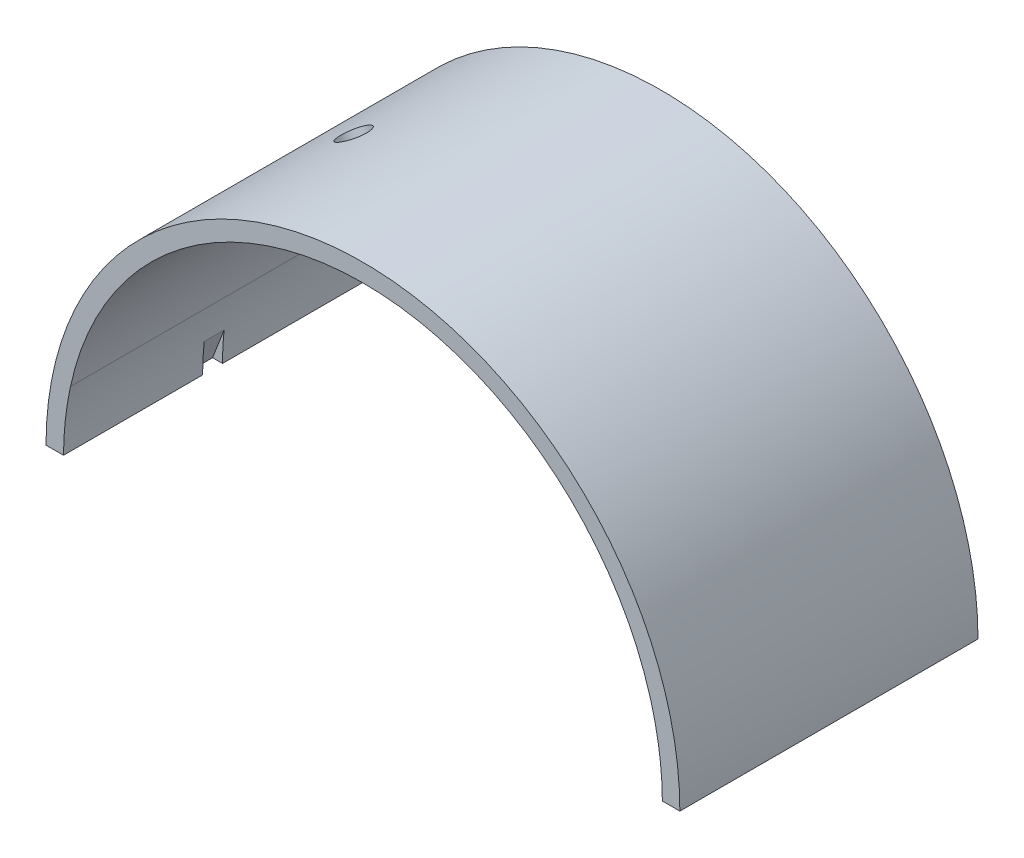
ISO-10303-21;
HEADER;
FILE_DESCRIPTION(('STEP AP214'),'2;1');
FILE_NAME('part.step','',(''),(''),'','','');
FILE_SCHEMA(('AUTOMOTIVE_DESIGN { 1 0 10303 214 1 1 1 1 }'));
ENDSEC;
DATA;
#1=APPLICATION_CONTEXT('core data for automotive mechanical design processes');
#2=APPLICATION_PROTOCOL_DEFINITION('international standard','automotive_design',2000,#1);
#3=PRODUCT_CONTEXT('',#1,'mechanical');
#4=PRODUCT('Part','Part','',(#3));
#5=PRODUCT_RELATED_PRODUCT_CATEGORY('part','',(#4));
#6=PRODUCT_DEFINITION_FORMATION('','',#4);
#7=PRODUCT_DEFINITION_CONTEXT('part definition',#1,'design');
#8=PRODUCT_DEFINITION('design','',#6,#7);
#9=PRODUCT_DEFINITION_SHAPE('','',#8);
#10=(LENGTH_UNIT() NAMED_UNIT(*) SI_UNIT(.MILLI.,.METRE.));
#11=(NAMED_UNIT(*) PLANE_ANGLE_UNIT() SI_UNIT($,.RADIAN.));
#12=(NAMED_UNIT(*) SI_UNIT($,.STERADIAN.) SOLID_ANGLE_UNIT());
#13=UNCERTAINTY_MEASURE_WITH_UNIT(LENGTH_MEASURE(1.E-05),#10,'distance_accuracy_value','');
#14=(GEOMETRIC_REPRESENTATION_CONTEXT(3) GLOBAL_UNCERTAINTY_ASSIGNED_CONTEXT((#13)) GLOBAL_UNIT_ASSIGNED_CONTEXT((#10,
#11,#12)) REPRESENTATION_CONTEXT('',''));
#15=CARTESIAN_POINT('',(0.,0.,0.));
#16=DIRECTION('',(0.,0.,1.));
#17=DIRECTION('',(1.,0.,0.));
#18=AXIS2_PLACEMENT_3D('',#15,#16,#17);
#19=CARTESIAN_POINT('',(-31.891178343949,0.,15.));
#20=DIRECTION('',(0.,1.,0.));
#21=DIRECTION('',(0.,0.,1.));
#22=AXIS2_PLACEMENT_3D('',#19,#20,#21);
#23=PLANE('',#22);
#24=DIRECTION('',(1.,0.,0.));
#25=VECTOR('',#24,1.);
#26=CARTESIAN_POINT('',(-30.5165696324547,0.,-0.999999999999994));
#27=LINE('',#26,#25);
#28=CARTESIAN_POINT('',(-31.129278343949,0.,-0.999999999999994));
#29=VERTEX_POINT('',#28);
#30=CARTESIAN_POINT('',(-30.129278343949,0.,-0.999999999999994));
#31=VERTEX_POINT('',#30);
#32=EDGE_CURVE('E160',#29,#31,#27,.T.);
#33=ORIENTED_EDGE('',*,*,#32,.F.);
#34=DIRECTION('',(0.,0.,-1.));
#35=VECTOR('',#34,1.);
#36=CARTESIAN_POINT('',(-31.129278343949,0.,-0.999999999999994));
#37=LINE('',#36,#35);
#38=CARTESIAN_POINT('',(-31.129278343949,0.,1.00000000000001));
#39=VERTEX_POINT('',#38);
#40=EDGE_CURVE('E158',#39,#29,#37,.T.);
#41=ORIENTED_EDGE('',*,*,#40,.F.);
#42=DIRECTION('',(-1.,0.,0.));
#43=VECTOR('',#42,1.);
#44=CARTESIAN_POINT('',(-30.5165696324547,0.,1.00000000000001));
#45=LINE('',#44,#43);
#46=CARTESIAN_POINT('',(-30.129278343949,0.,1.00000000000001));
#47=VERTEX_POINT('',#46);
#48=EDGE_CURVE('E145',#47,#39,#45,.T.);
#49=ORIENTED_EDGE('',*,*,#48,.F.);
#50=DIRECTION('',(0.,0.,-1.));
#51=VECTOR('',#50,1.);
#52=CARTESIAN_POINT('',(-30.129278343949,0.,15.));
#53=LINE('',#52,#51);
#54=CARTESIAN_POINT('',(-30.129278343949,0.,15.));
#55=VERTEX_POINT('',#54);
#56=EDGE_CURVE('E156',#55,#47,#53,.T.);
#57=ORIENTED_EDGE('',*,*,#56,.F.);
#58=DIRECTION('',(1.,0.,0.));
#59=VECTOR('',#58,1.);
#60=CARTESIAN_POINT('',(-31.891178343949,0.,15.));
#61=LINE('',#60,#59);
#62=CARTESIAN_POINT('',(-31.891178343949,0.,15.));
#63=VERTEX_POINT('',#62);
#64=EDGE_CURVE('E181',#63,#55,#61,.T.);
#65=ORIENTED_EDGE('',*,*,#64,.F.);
#66=DIRECTION('',(0.,0.,-1.));
#67=VECTOR('',#66,1.);
#68=CARTESIAN_POINT('',(-31.891178343949,0.,15.));
#69=LINE('',#68,#67);
#70=CARTESIAN_POINT('',(-31.891178343949,0.,1.));
#71=VERTEX_POINT('',#70);
#72=EDGE_CURVE('E11',#63,#71,#69,.T.);
#73=ORIENTED_EDGE('',*,*,#72,.T.);
#74=DIRECTION('',(1.,0.,0.));
#75=VECTOR('',#74,1.);
#76=CARTESIAN_POINT('',(-31.891178343949,0.,1.));
#77=LINE('',#76,#75);
#78=CARTESIAN_POINT('',(-32.891178343949,0.,1.));
#79=VERTEX_POINT('',#78);
#80=EDGE_CURVE('E265',#79,#71,#77,.T.);
#81=ORIENTED_EDGE('',*,*,#80,.F.);
#82=DIRECTION('',(0.,0.,1.));
#83=VECTOR('',#82,1.);
#84=CARTESIAN_POINT('',(-32.891178343949,0.,-1.));
#85=LINE('',#84,#83);
#86=CARTESIAN_POINT('',(-32.891178343949,0.,-1.));
#87=VERTEX_POINT('',#86);
#88=EDGE_CURVE('E276',#87,#79,#85,.T.);
#89=ORIENTED_EDGE('',*,*,#88,.F.);
#90=DIRECTION('',(-1.,0.,0.));
#91=VECTOR('',#90,1.);
#92=CARTESIAN_POINT('',(-31.891178343949,0.,-1.));
#93=LINE('',#92,#91);
#94=CARTESIAN_POINT('',(-31.891178343949,0.,-1.));
#95=VERTEX_POINT('',#94);
#96=EDGE_CURVE('E203',#95,#87,#93,.T.);
#97=ORIENTED_EDGE('',*,*,#96,.F.);
#98=CARTESIAN_POINT('',(-31.891178343949,0.,-15.));
#99=VERTEX_POINT('',#98);
#100=EDGE_CURVE('E61',#95,#99,#69,.T.);
#101=ORIENTED_EDGE('',*,*,#100,.T.);
#102=DIRECTION('',(1.,0.,0.));
#103=VECTOR('',#102,1.);
#104=CARTESIAN_POINT('',(-31.891178343949,0.,-15.));
#105=LINE('',#104,#103);
#106=CARTESIAN_POINT('',(-30.129278343949,0.,-15.));
#107=VERTEX_POINT('',#106);
#108=EDGE_CURVE('E189',#99,#107,#105,.T.);
#109=ORIENTED_EDGE('',*,*,#108,.T.);
#110=EDGE_CURVE('E166',#31,#107,#53,.T.);
#111=ORIENTED_EDGE('',*,*,#110,.F.);
#112=EDGE_LOOP('',(#33,#41,#49,#57,#65,#73,#81,#89,#97,#101,#109,#111));
#113=FACE_BOUND('',#112,.T.);
#114=ADVANCED_FACE('F46',(#113),#23,.F.);
#115=CARTESIAN_POINT('',(0.,-0.116742127165869,15.));
#116=DIRECTION('',(0.,0.,-1.));
#117=DIRECTION('',(-1.,0.,0.));
#118=AXIS2_PLACEMENT_3D('',#115,#116,#117);
#119=CYLINDRICAL_SURFACE('',#118,30.1295045138716);
#120=CARTESIAN_POINT('',(0.,-0.116742127165869,1.00000000000001));
#121=DIRECTION('',(0.,0.,1.));
#122=DIRECTION('',(1.,0.,0.));
#123=AXIS2_PLACEMENT_3D('',#120,#121,#122);
#124=CIRCLE('',#123,30.1295045138716);
#125=CARTESIAN_POINT('',(-29.9678654689346,2.99999999999989,1.00000000000001));
#126=VERTEX_POINT('',#125);
#127=EDGE_CURVE('E142',#126,#47,#124,.T.);
#128=ORIENTED_EDGE('',*,*,#127,.F.);
#129=DIRECTION('',(0.,0.,-1.));
#130=VECTOR('',#129,1.);
#131=CARTESIAN_POINT('',(-29.9678654689346,2.99999999999989,15.));
#132=LINE('',#131,#130);
#133=CARTESIAN_POINT('',(-29.9678654689346,2.99999999999987,-0.999999999999994));
#134=VERTEX_POINT('',#133);
#135=EDGE_CURVE('E151',#134,#126,#132,.F.);
#136=ORIENTED_EDGE('',*,*,#135,.F.);
#137=CARTESIAN_POINT('',(0.,-0.116742127165869,-0.999999999999994));
#138=DIRECTION('',(0.,0.,-1.));
#139=DIRECTION('',(-1.,0.,0.));
#140=AXIS2_PLACEMENT_3D('',#137,#138,#139);
#141=CIRCLE('',#140,30.1295045138716);
#142=EDGE_CURVE('E150',#31,#134,#141,.T.);
#143=ORIENTED_EDGE('',*,*,#142,.F.);
#144=ORIENTED_EDGE('',*,*,#110,.T.);
#145=CARTESIAN_POINT('',(0.,-0.116742127165869,-15.));
#146=DIRECTION('',(0.,0.,-1.));
#147=DIRECTION('',(-1.,0.,0.));
#148=AXIS2_PLACEMENT_3D('',#145,#146,#147);
#149=CIRCLE('',#148,30.1295045138716);
#150=CARTESIAN_POINT('',(-29.4273391340799,6.35,-15.));
#151=VERTEX_POINT('',#150);
#152=EDGE_CURVE('E208',#107,#151,#149,.T.);
#153=ORIENTED_EDGE('',*,*,#152,.T.);
#154=DIRECTION('',(0.,0.,-1.));
#155=VECTOR('',#154,1.);
#156=CARTESIAN_POINT('',(-29.4273391340799,6.35,15.));
#157=LINE('',#156,#155);
#158=CARTESIAN_POINT('',(-29.4273391340799,6.35,15.));
#159=VERTEX_POINT('',#158);
#160=EDGE_CURVE('E171',#159,#151,#157,.T.);
#161=ORIENTED_EDGE('',*,*,#160,.F.);
#162=CARTESIAN_POINT('',(0.,-0.116742127165869,15.));
#163=DIRECTION('',(0.,0.,-1.));
#164=DIRECTION('',(-1.,0.,0.));
#165=AXIS2_PLACEMENT_3D('',#162,#163,#164);
#166=CIRCLE('',#165,30.1295045138716);
#167=EDGE_CURVE('E164',#55,#159,#166,.T.);
#168=ORIENTED_EDGE('',*,*,#167,.F.);
#169=ORIENTED_EDGE('',*,*,#56,.T.);
#170=EDGE_LOOP('',(#128,#136,#143,#144,#153,#161,#168,#169));
#171=FACE_BOUND('',#170,.T.);
#172=ADVANCED_FACE('F162',(#171),#119,.F.);
#173=CARTESIAN_POINT('',(0.,0.,15.));
#174=DIRECTION('',(0.,0.,-1.));
#175=DIRECTION('',(-1.,0.,0.));
#176=AXIS2_PLACEMENT_3D('',#173,#174,#175);
#177=CYLINDRICAL_SURFACE('',#176,31.891178343949);
#178=CARTESIAN_POINT('',(-17.2269794052102,26.8380035907671,0.));
#179=CARTESIAN_POINT('',(-17.2269764221682,26.8380058609576,-0.0842056450766566));
#180=CARTESIAN_POINT('',(-17.2209868831049,26.8418530440884,-0.168471160939302));
#181=CARTESIAN_POINT('',(-17.197164282728,26.8571217602558,-0.334678044970872));
#182=CARTESIAN_POINT('',(-17.1793172321434,26.868552239901,-0.416616548567354));
#183=CARTESIAN_POINT('',(-17.1322500035602,26.898588082943,-0.575737654412829));
#184=CARTESIAN_POINT('',(-17.103035581206,26.9171898152736,-0.652922640639571));
#185=CARTESIAN_POINT('',(-17.0340083472838,26.9609250041165,-0.800367786812533));
#186=CARTESIAN_POINT('',(-16.9941980527663,26.9860569093518,-0.87062958593825));
#187=CARTESIAN_POINT('',(-16.9049901400141,27.042028976799,-1.00231902878046));
#188=CARTESIAN_POINT('',(-16.8555849162159,27.0728736664298,-1.06373959666824));
#189=CARTESIAN_POINT('',(-16.7485194559597,27.1392393159317,-1.1759428236805));
#190=CARTESIAN_POINT('',(-16.6908588841939,27.174760465742,-1.22672505050055));
#191=CARTESIAN_POINT('',(-16.5688073470163,27.2493484093221,-1.31622871656887));
#192=CARTESIAN_POINT('',(-16.5044133943565,27.2884167757851,-1.35494477211088));
#193=CARTESIAN_POINT('',(-16.3706739971853,27.3688577049482,-1.41918249867796));
#194=CARTESIAN_POINT('',(-16.3013285869775,27.4102302516847,-1.44470426110272));
#195=CARTESIAN_POINT('',(-16.1596609466876,27.4939880121863,-1.48181059169305));
#196=CARTESIAN_POINT('',(-16.0873409794731,27.5363724462328,-1.49340555890213));
#197=CARTESIAN_POINT('',(-15.9417086529291,27.6209389848679,-1.50236124687815));
#198=CARTESIAN_POINT('',(-15.8683963007211,27.6631210909055,-1.49972206973864));
#199=CARTESIAN_POINT('',(-15.72292673155,27.7460598607561,-1.4802930308368));
#200=CARTESIAN_POINT('',(-15.6507686466639,27.7868176258075,-1.46351436502192));
#201=CARTESIAN_POINT('',(-15.5096273781504,27.8658439838574,-1.41629998423326));
#202=CARTESIAN_POINT('',(-15.4406442067061,27.9041125673047,-1.38586421685857));
#203=CARTESIAN_POINT('',(-15.3078361477129,27.9771900352875,-1.31218681102004));
#204=CARTESIAN_POINT('',(-15.2440133300843,28.0119975327869,-1.26894006594031));
#205=CARTESIAN_POINT('',(-15.1234356545729,28.0772801130353,-1.17087205699758));
#206=CARTESIAN_POINT('',(-15.0666808405401,28.1077551689059,-1.11605072133144));
#207=CARTESIAN_POINT('',(-14.9618761780566,28.1636833062481,-0.996326401297222));
#208=CARTESIAN_POINT('',(-14.9138348139492,28.1891314951513,-0.931413703879964));
#209=CARTESIAN_POINT('',(-14.8279706554981,28.2343922523684,-0.793383437425425));
#210=CARTESIAN_POINT('',(-14.7901478636445,28.254204819309,-0.720265866388825));
#211=CARTESIAN_POINT('',(-14.7258693132093,28.2877597263124,-0.567895549585972));
#212=CARTESIAN_POINT('',(-14.699413871651,28.3015018970786,-0.488642632784223));
#213=CARTESIAN_POINT('',(-14.6586828258239,28.3226200208312,-0.326253959852263));
#214=CARTESIAN_POINT('',(-14.6444071404823,28.3299960161932,-0.243118229571347));
#215=CARTESIAN_POINT('',(-14.6284833152174,28.3382217873299,-0.0754091434874956));
#216=CARTESIAN_POINT('',(-14.6268230899267,28.3390778091153,0.00916275860891153));
#217=CARTESIAN_POINT('',(-14.6361495272225,28.3342621161224,0.177418470200039));
#218=CARTESIAN_POINT('',(-14.6471361528807,28.3285904204047,0.26110228228722));
#219=CARTESIAN_POINT('',(-14.6814098578441,28.3108429591999,0.42516821363886));
#220=CARTESIAN_POINT('',(-14.7046914219131,28.2987700651385,0.505551795902393));
#221=CARTESIAN_POINT('',(-14.7628385871366,28.268479292039,0.660780517473766));
#222=CARTESIAN_POINT('',(-14.7977042475009,28.2502613815919,0.735625628470406));
#223=CARTESIAN_POINT('',(-14.877991089704,28.2080606879219,0.877715364740084));
#224=CARTESIAN_POINT('',(-14.9234202888733,28.1840735255754,0.944954159195232));
#225=CARTESIAN_POINT('',(-15.0234508504027,28.1308794943418,1.06986396292068));
#226=CARTESIAN_POINT('',(-15.0780522650489,28.1016725956995,1.12753491764585));
#227=CARTESIAN_POINT('',(-15.1948441591757,28.0386940466726,1.23171758809203));
#228=CARTESIAN_POINT('',(-15.2570405485763,28.0049188392966,1.27822052903582));
#229=CARTESIAN_POINT('',(-15.3871478289687,27.933643381646,1.3586871436488));
#230=CARTESIAN_POINT('',(-15.4550586972304,27.8961431461882,1.39265086719174));
#231=CARTESIAN_POINT('',(-15.5945761926358,27.8183899477341,1.44705958460348));
#232=CARTESIAN_POINT('',(-15.6661812683339,27.778138138037,1.46751020450268));
#233=CARTESIAN_POINT('',(-15.8110385655931,27.6959428024275,1.4943306241586));
#234=CARTESIAN_POINT('',(-15.8842907792719,27.65399928461,1.5007004912835));
#235=CARTESIAN_POINT('',(-16.0302747839915,27.5696327000437,1.49917793050085));
#236=CARTESIAN_POINT('',(-16.1030070094162,27.5272101356958,1.49129927444848));
#237=CARTESIAN_POINT('',(-16.2459734016713,27.4430772114307,1.46153176221857));
#238=CARTESIAN_POINT('',(-16.3162075637439,27.4013668528701,1.43964287935749));
#239=CARTESIAN_POINT('',(-16.4522291219588,27.319914033431,1.38247899099652));
#240=CARTESIAN_POINT('',(-16.5180164754669,27.280171591421,1.34720385717579));
#241=CARTESIAN_POINT('',(-16.6433442748004,27.2038919304584,1.26427136489092));
#242=CARTESIAN_POINT('',(-16.7028849184202,27.1673546100255,1.21661439864856));
#243=CARTESIAN_POINT('',(-16.8141661597925,27.0986228685024,1.11022237879009));
#244=CARTESIAN_POINT('',(-16.8659000242166,27.0664321988766,1.05147785935329));
#245=CARTESIAN_POINT('',(-16.9601388362978,27.0074812869669,0.924581961757363));
#246=CARTESIAN_POINT('',(-17.0026415075932,26.9807223842331,0.85642827010956));
#247=CARTESIAN_POINT('',(-17.0773100108398,26.9335236846584,0.712599934019657));
#248=CARTESIAN_POINT('',(-17.1094664725387,26.9130896166636,0.636918552714937));
#249=CARTESIAN_POINT('',(-17.1625136260816,26.8792927884508,0.480288371734973));
#250=CARTESIAN_POINT('',(-17.1834176478927,26.8659216616205,0.399345932483891));
#251=CARTESIAN_POINT('',(-17.2079220974974,26.8502288805887,0.264915879462323));
#252=CARTESIAN_POINT('',(-17.2150601080429,26.845651309204,0.21229934082207));
#253=CARTESIAN_POINT('',(-17.2245897032086,26.8395379477121,0.106463180096452));
#254=CARTESIAN_POINT('',(-17.2269812913993,26.8380021553168,0.0532435584647782));
#255=CARTESIAN_POINT('',(-17.2269794052102,26.8380035907671,0.));
#256=B_SPLINE_CURVE_WITH_KNOTS('',3,(#178,#179,#180,#181,#182,#183,#184,#185,#186,#187,#188,
#189,#190,#191,#192,#193,#194,#195,#196,#197,#198,#199,#200,#201,#202,#203,#204,#205,#206,#207,
#208,#209,#210,#211,#212,#213,#214,#215,#216,#217,#218,#219,#220,#221,#222,#223,#224,#225,#226,
#227,#228,#229,#230,#231,#232,#233,#234,#235,#236,#237,#238,#239,#240,#241,#242,#243,#244,#245,
#246,#247,#248,#249,#250,#251,#252,#253,#254,#255),.UNSPECIFIED.,.T.,.F.,(4,2,2,2,2,2,2,2,2,2,2,
2,2,2,2,2,2,2,2,2,2,2,2,2,2,2,2,2,2,2,2,2,2,2,2,2,2,2,4),(0.,0.252422578213682,
0.505143489953848,0.757736607609462,1.01026977521504,1.26300394008331,1.51574837317983,
1.76860541533366,2.02146070586912,2.27412707346566,2.52679162883007,2.77925630681321,
3.03172195348573,3.28428837185049,3.5368563570604,3.78966896434948,4.04248163324273,
4.29530135235346,4.54811938859166,4.80069519945669,5.05327027281445,5.30573214272693,
5.55819530306863,5.81085070254359,6.06350754232774,6.31636225139882,6.56921595474897,
6.82196431882982,7.07471147365475,7.32721446723857,7.57971794173496,7.8322238367954,
8.08472173415093,8.33743618067421,8.59021287462014,8.84321786061515,9.09592246625196,
9.25553036900807,9.41513815170146),.UNSPECIFIED.);
#257=CARTESIAN_POINT('',(-17.2269794052102,26.8380035907671,0.));
#258=VERTEX_POINT('',#257);
#259=EDGE_CURVE('E284',#258,#258,#256,.T.);
#260=ORIENTED_EDGE('',*,*,#259,.T.);
#261=EDGE_LOOP('',(#260));
#262=FACE_BOUND('',#261,.T.);
#263=DIRECTION('',(0.,0.,1.));
#264=VECTOR('',#263,1.);
#265=CARTESIAN_POINT('',(-31.7497599387076,3.,-1.));
#266=LINE('',#265,#264);
#267=CARTESIAN_POINT('',(-31.7497599387076,3.,-1.));
#268=VERTEX_POINT('',#267);
#269=CARTESIAN_POINT('',(-31.7497599387076,3.,1.));
#270=VERTEX_POINT('',#269);
#271=EDGE_CURVE('E211',#268,#270,#266,.T.);
#272=ORIENTED_EDGE('',*,*,#271,.T.);
#273=CARTESIAN_POINT('',(0.,0.,0.999999999999994));
#274=DIRECTION('',(0.,0.,1.));
#275=DIRECTION('',(1.,0.,0.));
#276=AXIS2_PLACEMENT_3D('',#273,#274,#275);
#277=CIRCLE('',#276,31.891178343949);
#278=EDGE_CURVE('E247',#270,#71,#277,.T.);
#279=ORIENTED_EDGE('',*,*,#278,.T.);
#280=ORIENTED_EDGE('',*,*,#72,.F.);
#281=CARTESIAN_POINT('',(0.,0.,15.));
#282=DIRECTION('',(0.,0.,1.));
#283=DIRECTION('',(-1.,0.,0.));
#284=AXIS2_PLACEMENT_3D('',#281,#282,#283);
#285=CIRCLE('',#284,31.891178343949);
#286=CARTESIAN_POINT('',(31.891178343949,0.,15.));
#287=VERTEX_POINT('',#286);
#288=EDGE_CURVE('E178',#287,#63,#285,.T.);
#289=ORIENTED_EDGE('',*,*,#288,.F.);
#290=DIRECTION('',(0.,0.,-1.));
#291=VECTOR('',#290,1.);
#292=CARTESIAN_POINT('',(31.891178343949,0.,15.));
#293=LINE('',#292,#291);
#294=CARTESIAN_POINT('',(31.891178343949,0.,-15.));
#295=VERTEX_POINT('',#294);
#296=EDGE_CURVE('E186',#287,#295,#293,.T.);
#297=ORIENTED_EDGE('',*,*,#296,.T.);
#298=CARTESIAN_POINT('',(0.,0.,-15.));
#299=DIRECTION('',(0.,0.,1.));
#300=DIRECTION('',(-1.,0.,0.));
#301=AXIS2_PLACEMENT_3D('',#298,#299,#300);
#302=CIRCLE('',#301,31.891178343949);
#303=EDGE_CURVE('E177',#295,#99,#302,.T.);
#304=ORIENTED_EDGE('',*,*,#303,.T.);
#305=ORIENTED_EDGE('',*,*,#100,.F.);
#306=CARTESIAN_POINT('',(0.,0.,-1.00000000000001));
#307=DIRECTION('',(0.,0.,-1.));
#308=DIRECTION('',(-1.,0.,0.));
#309=AXIS2_PLACEMENT_3D('',#306,#307,#308);
#310=CIRCLE('',#309,31.891178343949);
#311=EDGE_CURVE('E270',#95,#268,#310,.T.);
#312=ORIENTED_EDGE('',*,*,#311,.T.);
#313=EDGE_LOOP('',(#272,#279,#280,#289,#297,#304,#305,#312));
#314=FACE_BOUND('',#313,.T.);
#315=ADVANCED_FACE('F48',(#262,#314),#177,.T.);
#316=CARTESIAN_POINT('',(30.472178343949,0.,15.));
#317=DIRECTION('',(0.,1.,0.));
#318=DIRECTION('',(0.,0.,1.));
#319=AXIS2_PLACEMENT_3D('',#316,#317,#318);
#320=PLANE('',#319);
#321=DIRECTION('',(1.,0.,0.));
#322=VECTOR('',#321,1.);
#323=CARTESIAN_POINT('',(30.472178343949,0.,-15.));
#324=LINE('',#323,#322);
#325=CARTESIAN_POINT('',(30.129278343949,0.,-15.));
#326=VERTEX_POINT('',#325);
#327=EDGE_CURVE('E182',#326,#295,#324,.T.);
#328=ORIENTED_EDGE('',*,*,#327,.T.);
#329=ORIENTED_EDGE('',*,*,#296,.F.);
#330=DIRECTION('',(1.,0.,0.));
#331=VECTOR('',#330,1.);
#332=CARTESIAN_POINT('',(30.472178343949,0.,15.));
#333=LINE('',#332,#331);
#334=CARTESIAN_POINT('',(30.129278343949,0.,15.));
#335=VERTEX_POINT('',#334);
#336=EDGE_CURVE('E184',#335,#287,#333,.T.);
#337=ORIENTED_EDGE('',*,*,#336,.F.);
#338=DIRECTION('',(0.,0.,-1.));
#339=VECTOR('',#338,1.);
#340=CARTESIAN_POINT('',(30.129278343949,0.,15.));
#341=LINE('',#340,#339);
#342=EDGE_CURVE('E165',#335,#326,#341,.T.);
#343=ORIENTED_EDGE('',*,*,#342,.T.);
#344=EDGE_LOOP('',(#328,#329,#337,#343));
#345=FACE_BOUND('',#344,.T.);
#346=ADVANCED_FACE('F213',(#345),#320,.F.);
#347=CARTESIAN_POINT('',(0.,0.,15.));
#348=DIRECTION('',(0.,0.,-1.));
#349=DIRECTION('',(-1.,0.,0.));
#350=AXIS2_PLACEMENT_3D('',#347,#348,#349);
#351=PLANE('',#350);
#352=ORIENTED_EDGE('',*,*,#288,.T.);
#353=ORIENTED_EDGE('',*,*,#64,.T.);
#354=ORIENTED_EDGE('',*,*,#167,.T.);
#355=CARTESIAN_POINT('',(0.,0.,15.));
#356=DIRECTION('',(0.,0.,-1.));
#357=DIRECTION('',(1.,0.,0.));
#358=AXIS2_PLACEMENT_3D('',#355,#356,#357);
#359=ELLIPSE('',#358,30.1052922759765,30.091178343949);
#360=CARTESIAN_POINT('',(29.4273391340799,6.35,15.));
#361=VERTEX_POINT('',#360);
#362=EDGE_CURVE('E241',#159,#361,#359,.T.);
#363=ORIENTED_EDGE('',*,*,#362,.T.);
#364=CARTESIAN_POINT('',(0.,-0.116742127165869,15.));
#365=DIRECTION('',(0.,0.,-1.));
#366=DIRECTION('',(-1.,0.,0.));
#367=AXIS2_PLACEMENT_3D('',#364,#365,#366);
#368=CIRCLE('',#367,30.1295045138716);
#369=EDGE_CURVE('E246',#361,#335,#368,.T.);
#370=ORIENTED_EDGE('',*,*,#369,.T.);
#371=ORIENTED_EDGE('',*,*,#336,.T.);
#372=EDGE_LOOP('',(#352,#353,#354,#363,#370,#371));
#373=FACE_BOUND('',#372,.T.);
#374=ADVANCED_FACE('F220',(#373),#351,.F.);
#375=CARTESIAN_POINT('',(0.,0.,-15.));
#376=DIRECTION('',(0.,0.,-1.));
#377=DIRECTION('',(-1.,0.,0.));
#378=AXIS2_PLACEMENT_3D('',#375,#376,#377);
#379=PLANE('',#378);
#380=ORIENTED_EDGE('',*,*,#303,.F.);
#381=ORIENTED_EDGE('',*,*,#327,.F.);
#382=CARTESIAN_POINT('',(0.,-0.116742127165869,-15.));
#383=DIRECTION('',(0.,0.,-1.));
#384=DIRECTION('',(-1.,0.,0.));
#385=AXIS2_PLACEMENT_3D('',#382,#383,#384);
#386=CIRCLE('',#385,30.1295045138716);
#387=CARTESIAN_POINT('',(29.4273391340799,6.35,-15.));
#388=VERTEX_POINT('',#387);
#389=EDGE_CURVE('E255',#388,#326,#386,.T.);
#390=ORIENTED_EDGE('',*,*,#389,.F.);
#391=CARTESIAN_POINT('',(0.,0.,-15.));
#392=DIRECTION('',(0.,0.,-1.));
#393=DIRECTION('',(1.,0.,0.));
#394=AXIS2_PLACEMENT_3D('',#391,#392,#393);
#395=ELLIPSE('',#394,30.1052922759765,30.091178343949);
#396=EDGE_CURVE('E252',#151,#388,#395,.T.);
#397=ORIENTED_EDGE('',*,*,#396,.F.);
#398=ORIENTED_EDGE('',*,*,#152,.F.);
#399=ORIENTED_EDGE('',*,*,#108,.F.);
#400=EDGE_LOOP('',(#380,#381,#390,#397,#398,#399));
#401=FACE_BOUND('',#400,.T.);
#402=ADVANCED_FACE('F206',(#401),#379,.T.);
#403=DIRECTION('',(0.,0.,-1.));
#404=VECTOR('',#403,1.);
#405=SURFACE_OF_LINEAR_EXTRUSION('',#359,#404);
#406=CARTESIAN_POINT('',(-16.3280012535646,25.2809277572226,0.));
#407=CARTESIAN_POINT('',(-16.3279965762241,25.2809312135073,0.0842117590300801));
#408=CARTESIAN_POINT('',(-16.3220084177227,25.284798079561,0.168509865359818));
#409=CARTESIAN_POINT('',(-16.3041838309145,25.2962810020468,0.293077971021965));
#410=CARTESIAN_POINT('',(-16.2967589366128,25.3010619498857,0.334320253900629));
#411=CARTESIAN_POINT('',(-16.2790026489177,25.3124795508876,0.415955367859103));
#412=CARTESIAN_POINT('',(-16.2686686986059,25.3191178365289,0.456347417906031));
#413=CARTESIAN_POINT('',(-16.233427842791,25.3417177100438,0.575645599697456));
#414=CARTESIAN_POINT('',(-16.2042580861679,25.3603797825225,0.652839628142575));
#415=CARTESIAN_POINT('',(-16.1353072968991,25.4042630690775,0.800317334279283));
#416=CARTESIAN_POINT('',(-16.0955259804028,25.4294844586097,0.870600827050799));
#417=CARTESIAN_POINT('',(-16.028713519984,25.4715702414428,0.969351422870904));
#418=CARTESIAN_POINT('',(-16.0052241671489,25.4863255357208,1.001185779214));
#419=CARTESIAN_POINT('',(-15.9560395471844,25.5171181901848,1.06237913760693));
#420=CARTESIAN_POINT('',(-15.9303464229036,25.5331543039382,1.09174049043663));
#421=CARTESIAN_POINT('',(-15.8501514581451,25.5830249249098,1.17585630677384));
#422=CARTESIAN_POINT('',(-15.7925174866557,25.6186321682,1.22666694821742));
#423=CARTESIAN_POINT('',(-15.6705312975992,25.693360483606,1.31619808513089));
#424=CARTESIAN_POINT('',(-15.6061758351731,25.7324832515879,1.35491270480662));
#425=CARTESIAN_POINT('',(-15.4724895783795,25.8130116949887,1.41915581719531));
#426=CARTESIAN_POINT('',(-15.4031588217382,25.8544173530966,1.44468440988188));
#427=CARTESIAN_POINT('',(-15.2615090287065,25.9382044854149,1.48179931970488));
#428=CARTESIAN_POINT('',(-15.189192554302,25.9805851097438,1.4933973433731));
#429=CARTESIAN_POINT('',(-15.0435462359888,26.0651099981842,1.50236109096266));
#430=CARTESIAN_POINT('',(-14.9702163999365,26.1072542641248,1.49972692516379));
#431=CARTESIAN_POINT('',(-14.8246986574012,26.1900809832117,1.48030996840332));
#432=CARTESIAN_POINT('',(-14.7525098099069,26.2307646803926,1.46353953111131));
#433=CARTESIAN_POINT('',(-14.611289941837,26.3096159164372,1.41634559249802));
#434=CARTESIAN_POINT('',(-14.5422589348512,26.347783444473,1.38592203242732));
#435=CARTESIAN_POINT('',(-14.4093376445721,26.4206432060108,1.31227043879236));
#436=CARTESIAN_POINT('',(-14.345449768978,26.4553338136723,1.2690364519916));
#437=CARTESIAN_POINT('',(-14.224734778803,26.5203755641378,1.17099563589853));
#438=CARTESIAN_POINT('',(-14.1679077141056,26.5507266762843,1.11618872485296));
#439=CARTESIAN_POINT('',(-14.0629509397431,26.6064156566524,0.996486473255317));
#440=CARTESIAN_POINT('',(-14.0148307882299,26.6317480183212,0.931580189544181));
#441=CARTESIAN_POINT('',(-13.9288171672313,26.6767932863753,0.793560065138363));
#442=CARTESIAN_POINT('',(-13.8909236996124,26.6965061917349,0.720446222945701));
#443=CARTESIAN_POINT('',(-13.8265189155979,26.7298881193259,0.568080797538733));
#444=CARTESIAN_POINT('',(-13.8000078139284,26.7435570275385,0.488829098568202));
#445=CARTESIAN_POINT('',(-13.7591856265351,26.7645628336685,0.326439806016312));
#446=CARTESIAN_POINT('',(-13.744874448052,26.7718997797295,0.243302241985328));
#447=CARTESIAN_POINT('',(-13.7289042909557,26.7800853329161,0.0755985292953748));
#448=CARTESIAN_POINT('',(-13.7272314950241,26.7809410258828,-0.00896595789083804));
#449=CARTESIAN_POINT('',(-13.7365535198432,26.7761651852054,-0.177208616818096));
#450=CARTESIAN_POINT('',(-13.7475482983724,26.7705336731835,-0.260886791512318));
#451=CARTESIAN_POINT('',(-13.7818559760741,26.7529041472159,-0.424938128974148));
#452=CARTESIAN_POINT('',(-13.8051625892117,26.7409093821335,-0.505312955776949));
#453=CARTESIAN_POINT('',(-13.8633730844713,26.7108055450016,-0.660527306960901));
#454=CARTESIAN_POINT('',(-13.8982770341048,26.6926964373589,-0.735366799116194));
#455=CARTESIAN_POINT('',(-13.9786527477938,26.6507317598675,-0.877457155727726));
#456=CARTESIAN_POINT('',(-14.0241336328139,26.6268712296581,-0.944701395674927));
#457=CARTESIAN_POINT('',(-14.1242718791332,26.5739376996141,-1.06962583542866));
#458=CARTESIAN_POINT('',(-14.1789292998163,26.5448646660478,-1.12730597333836));
#459=CARTESIAN_POINT('',(-14.2958384994261,26.4821447304138,-1.23151722210639));
#460=CARTESIAN_POINT('',(-14.3580970544009,26.4484937442213,-1.27803827403871));
#461=CARTESIAN_POINT('',(-14.4883229171202,26.3774482911317,-1.35854214683703));
#462=CARTESIAN_POINT('',(-14.55629020044,26.3400538402508,-1.39252502134377));
#463=CARTESIAN_POINT('',(-14.6959068969753,26.2624856591934,-1.44697071297423));
#464=CARTESIAN_POINT('',(-14.7675546095176,26.2223132097714,-1.46743971515856));
#465=CARTESIAN_POINT('',(-14.9124815541214,26.1402429323707,-1.49429728257193));
#466=CARTESIAN_POINT('',(-14.9857607769657,26.0983451141385,-1.50068592732853));
#467=CARTESIAN_POINT('',(-15.1317744752359,26.0140375497919,-1.49919827030896));
#468=CARTESIAN_POINT('',(-15.2045094586917,25.9716284135251,-1.49133755855865));
#469=CARTESIAN_POINT('',(-15.3474567174717,25.8874925450429,-1.46161484917408));
#470=CARTESIAN_POINT('',(-15.4176689883008,25.8457658140435,-1.43975282659243));
#471=CARTESIAN_POINT('',(-15.5536629740361,25.7642317291625,-1.38262016686565));
#472=CARTESIAN_POINT('',(-15.6194447397116,25.7244243532884,-1.34734968339913));
#473=CARTESIAN_POINT('',(-15.7133527555731,25.667145782792,-1.28521993138849));
#474=CARTESIAN_POINT('',(-15.743866600331,25.6484550627849,-1.26296763479783));
#475=CARTESIAN_POINT('',(-15.8031621405358,25.611997205496,-1.21551548537804));
#476=CARTESIAN_POINT('',(-15.8319421417801,25.5942309738031,-1.19031281818312));
#477=CARTESIAN_POINT('',(-15.9153569690459,25.5425555183248,-1.11054115500033));
#478=CARTESIAN_POINT('',(-15.9670838233568,25.5102590125275,-1.05179708243613));
#479=CARTESIAN_POINT('',(-16.0612820379907,25.4511131782525,-0.924902058033846));
#480=CARTESIAN_POINT('',(-16.103753569944,25.424263748765,-0.856751280671614));
#481=CARTESIAN_POINT('',(-16.1596992422094,25.3887458447272,-0.748940483745026));
#482=CARTESIAN_POINT('',(-16.1770705188603,25.3776887477884,-0.712024648633022));
#483=CARTESIAN_POINT('',(-16.2090949031445,25.3572653730758,-0.636626506920394));
#484=CARTESIAN_POINT('',(-16.2237503978517,25.3478976106344,-0.598145612585238));
#485=CARTESIAN_POINT('',(-16.2634862421223,25.322460069853,-0.480756550627366));
#486=CARTESIAN_POINT('',(-16.2843975216649,25.3090168084778,-0.399783007750685));
#487=CARTESIAN_POINT('',(-16.3089209364349,25.2932316091838,-0.265269295157707));
#488=CARTESIAN_POINT('',(-16.3160664391612,25.2886254485179,-0.212585523508414));
#489=CARTESIAN_POINT('',(-16.3256080766151,25.2824724295362,-0.106612708000204));
#490=CARTESIAN_POINT('',(-16.3280042152999,25.2809255686712,-0.0533236646456373));
#491=CARTESIAN_POINT('',(-16.3280012535646,25.2809277572226,0.));
#492=B_SPLINE_CURVE_WITH_KNOTS('',3,(#406,#407,#408,#409,#410,#411,#412,#413,#414,#415,#416,
#417,#418,#419,#420,#421,#422,#423,#424,#425,#426,#427,#428,#429,#430,#431,#432,#433,#434,#435,
#436,#437,#438,#439,#440,#441,#442,#443,#444,#445,#446,#447,#448,#449,#450,#451,#452,#453,#454,
#455,#456,#457,#458,#459,#460,#461,#462,#463,#464,#465,#466,#467,#468,#469,#470,#471,#472,#473,
#474,#475,#476,#477,#478,#479,#480,#481,#482,#483,#484,#485,#486,#487,#488,#489,#490,#491),
.UNSPECIFIED.,.T.,.F.,(4,2,2,2,2,2,2,2,2,2,2,2,2,2,2,2,2,2,2,2,2,2,2,2,2,2,2,2,2,2,2,2,2,2,2,2,
2,2,2,2,2,2,4),(0.,0.252407275339326,0.378816578230536,0.505337337532494,0.757880520543681,
1.01043045955808,1.13697166466559,1.26339119217408,1.5161375616609,1.7690065156651,
2.02187355244339,2.2745279437997,2.52718037743674,2.77961224706549,3.03204520291931,
3.2845956534037,3.53714788801041,3.78997570569865,4.04280356953115,4.29563620270415,
4.54846691350354,4.80102116893465,5.05357458259482,5.30599917488986,5.55842523664601,
5.81106978919177,6.06371597673519,6.31658905371678,6.56946104884613,6.8222172285512,
7.07497198065532,7.32745036413179,7.5799291974729,7.83240513716153,7.95869050811818,
8.08509733994826,8.33784237535179,8.59058272346243,8.71726026291105,8.84382592371172,
9.09654358521898,9.2563703395068,9.41619696062636),.UNSPECIFIED.);
#493=CARTESIAN_POINT('',(-16.3280012535646,25.2809277572226,0.));
#494=VERTEX_POINT('',#493);
#495=EDGE_CURVE('E51',#494,#494,#492,.T.);
#496=ORIENTED_EDGE('',*,*,#495,.T.);
#497=EDGE_LOOP('',(#496));
#498=FACE_BOUND('',#497,.T.);
#499=ORIENTED_EDGE('',*,*,#396,.T.);
#500=DIRECTION('',(0.,0.,-1.));
#501=VECTOR('',#500,1.);
#502=CARTESIAN_POINT('',(29.4273391340799,6.35,15.));
#503=LINE('',#502,#501);
#504=EDGE_CURVE('E169',#361,#388,#503,.T.);
#505=ORIENTED_EDGE('',*,*,#504,.F.);
#506=ORIENTED_EDGE('',*,*,#362,.F.);
#507=ORIENTED_EDGE('',*,*,#160,.T.);
#508=EDGE_LOOP('',(#499,#505,#506,#507));
#509=FACE_BOUND('',#508,.T.);
#510=ADVANCED_FACE('F233',(#498,#509),#405,.F.);
#511=CARTESIAN_POINT('',(0.,-0.116742127165869,15.));
#512=DIRECTION('',(0.,0.,-1.));
#513=DIRECTION('',(-1.,0.,0.));
#514=AXIS2_PLACEMENT_3D('',#511,#512,#513);
#515=CYLINDRICAL_SURFACE('',#514,30.1295045138716);
#516=ORIENTED_EDGE('',*,*,#389,.T.);
#517=ORIENTED_EDGE('',*,*,#342,.F.);
#518=ORIENTED_EDGE('',*,*,#369,.F.);
#519=ORIENTED_EDGE('',*,*,#504,.T.);
#520=EDGE_LOOP('',(#516,#517,#518,#519));
#521=FACE_BOUND('',#520,.T.);
#522=ADVANCED_FACE('F239',(#521),#515,.F.);
#523=CARTESIAN_POINT('',(-31.891178343949,0.,1.));
#524=DIRECTION('',(0.,0.,1.));
#525=DIRECTION('',(1.,0.,0.));
#526=AXIS2_PLACEMENT_3D('',#523,#524,#525);
#527=PLANE('',#526);
#528=ORIENTED_EDGE('',*,*,#278,.F.);
#529=DIRECTION('',(0.355603869688965,0.934636767874148,0.));
#530=VECTOR('',#529,1.);
#531=CARTESIAN_POINT('',(-32.891178343949,0.,1.));
#532=LINE('',#531,#530);
#533=EDGE_CURVE('E271',#79,#270,#532,.T.);
#534=ORIENTED_EDGE('',*,*,#533,.F.);
#535=ORIENTED_EDGE('',*,*,#80,.T.);
#536=EDGE_LOOP('',(#528,#534,#535));
#537=FACE_BOUND('',#536,.T.);
#538=ADVANCED_FACE('F309',(#537),#527,.T.);
#539=CARTESIAN_POINT('',(-31.891178343949,0.,-1.));
#540=DIRECTION('',(0.,0.,-1.));
#541=DIRECTION('',(-1.,0.,0.));
#542=AXIS2_PLACEMENT_3D('',#539,#540,#541);
#543=PLANE('',#542);
#544=ORIENTED_EDGE('',*,*,#311,.F.);
#545=ORIENTED_EDGE('',*,*,#96,.T.);
#546=DIRECTION('',(0.355603869688965,0.934636767874148,0.));
#547=VECTOR('',#546,1.);
#548=CARTESIAN_POINT('',(-32.891178343949,0.,-1.));
#549=LINE('',#548,#547);
#550=EDGE_CURVE('E76',#87,#268,#549,.T.);
#551=ORIENTED_EDGE('',*,*,#550,.T.);
#552=EDGE_LOOP('',(#544,#545,#551));
#553=FACE_BOUND('',#552,.T.);
#554=ADVANCED_FACE('F307',(#553),#543,.T.);
#555=CARTESIAN_POINT('',(-32.891178343949,0.,-1.));
#556=DIRECTION('',(-0.934636767874148,0.355603869688965,0.));
#557=DIRECTION('',(-0.355603869688965,-0.934636767874148,0.));
#558=AXIS2_PLACEMENT_3D('',#555,#556,#557);
#559=PLANE('',#558);
#560=ORIENTED_EDGE('',*,*,#533,.T.);
#561=ORIENTED_EDGE('',*,*,#271,.F.);
#562=ORIENTED_EDGE('',*,*,#550,.F.);
#563=ORIENTED_EDGE('',*,*,#88,.T.);
#564=EDGE_LOOP('',(#560,#561,#562,#563));
#565=FACE_BOUND('',#564,.T.);
#566=ADVANCED_FACE('F304',(#565),#559,.T.);
#567=CARTESIAN_POINT('',(-30.5165696324547,-1.00039692215622,-0.999999999999994));
#568=DIRECTION('',(0.,0.,-1.));
#569=DIRECTION('',(-1.,0.,0.));
#570=AXIS2_PLACEMENT_3D('',#567,#568,#569);
#571=PLANE('',#570);
#572=ORIENTED_EDGE('',*,*,#142,.T.);
#573=DIRECTION('',(0.361027233469725,0.932555272728216,0.));
#574=VECTOR('',#573,1.);
#575=CARTESIAN_POINT('',(-31.5165696324547,-1.00039692215622,-0.999999999999994));
#576=LINE('',#575,#574);
#577=EDGE_CURVE('E159',#29,#134,#576,.T.);
#578=ORIENTED_EDGE('',*,*,#577,.F.);
#579=ORIENTED_EDGE('',*,*,#32,.T.);
#580=EDGE_LOOP('',(#572,#578,#579));
#581=FACE_BOUND('',#580,.T.);
#582=ADVANCED_FACE('F301',(#581),#571,.F.);
#583=CARTESIAN_POINT('',(-30.5165696324547,-1.00039692215622,1.00000000000001));
#584=DIRECTION('',(0.,0.,1.));
#585=DIRECTION('',(1.,0.,0.));
#586=AXIS2_PLACEMENT_3D('',#583,#584,#585);
#587=PLANE('',#586);
#588=ORIENTED_EDGE('',*,*,#127,.T.);
#589=ORIENTED_EDGE('',*,*,#48,.T.);
#590=DIRECTION('',(0.361027233469725,0.932555272728216,0.));
#591=VECTOR('',#590,1.);
#592=CARTESIAN_POINT('',(-31.5165696324547,-1.00039692215622,1.00000000000001));
#593=LINE('',#592,#591);
#594=EDGE_CURVE('E68',#39,#126,#593,.T.);
#595=ORIENTED_EDGE('',*,*,#594,.T.);
#596=EDGE_LOOP('',(#588,#589,#595));
#597=FACE_BOUND('',#596,.T.);
#598=ADVANCED_FACE('F144',(#597),#587,.F.);
#599=CARTESIAN_POINT('',(-31.5165696324547,-1.00039692215622,-0.999999999999994));
#600=DIRECTION('',(-0.932555272728216,0.361027233469725,0.));
#601=DIRECTION('',(-0.361027233469725,-0.932555272728216,0.));
#602=AXIS2_PLACEMENT_3D('',#599,#600,#601);
#603=PLANE('',#602);
#604=ORIENTED_EDGE('',*,*,#135,.T.);
#605=ORIENTED_EDGE('',*,*,#594,.F.);
#606=ORIENTED_EDGE('',*,*,#40,.T.);
#607=ORIENTED_EDGE('',*,*,#577,.T.);
#608=EDGE_LOOP('',(#604,#605,#606,#607));
#609=FACE_BOUND('',#608,.T.);
#610=ADVANCED_FACE('F295',(#609),#603,.F.);
#611=CARTESIAN_POINT('',(-15.9455891719744,27.6185706024801,0.));
#612=DIRECTION('',(-0.499999999999995,0.866025403784442,0.));
#613=DIRECTION('',(-0.866025403784442,-0.499999999999995,0.));
#614=AXIS2_PLACEMENT_3D('',#611,#612,#613);
#615=CYLINDRICAL_SURFACE('',#614,1.49999999999999);
#616=ORIENTED_EDGE('',*,*,#495,.F.);
#617=EDGE_LOOP('',(#616));
#618=FACE_BOUND('',#617,.T.);
#619=ORIENTED_EDGE('',*,*,#259,.F.);
#620=EDGE_LOOP('',(#619));
#621=FACE_BOUND('',#620,.T.);
#622=ADVANCED_FACE('F291',(#618,#621),#615,.F.);
#623=CLOSED_SHELL('',(#114,#172,#315,#346,#374,#402,#510,#522,#538,#554,#566,#582,#598,#610,#622));
#624=MANIFOLD_SOLID_BREP('B2',#623);
#625=ADVANCED_BREP_SHAPE_REPRESENTATION('',(#18,#624),#14);
#626=SHAPE_DEFINITION_REPRESENTATION(#9,#625);
ENDSEC;
END-ISO-10303-21;
